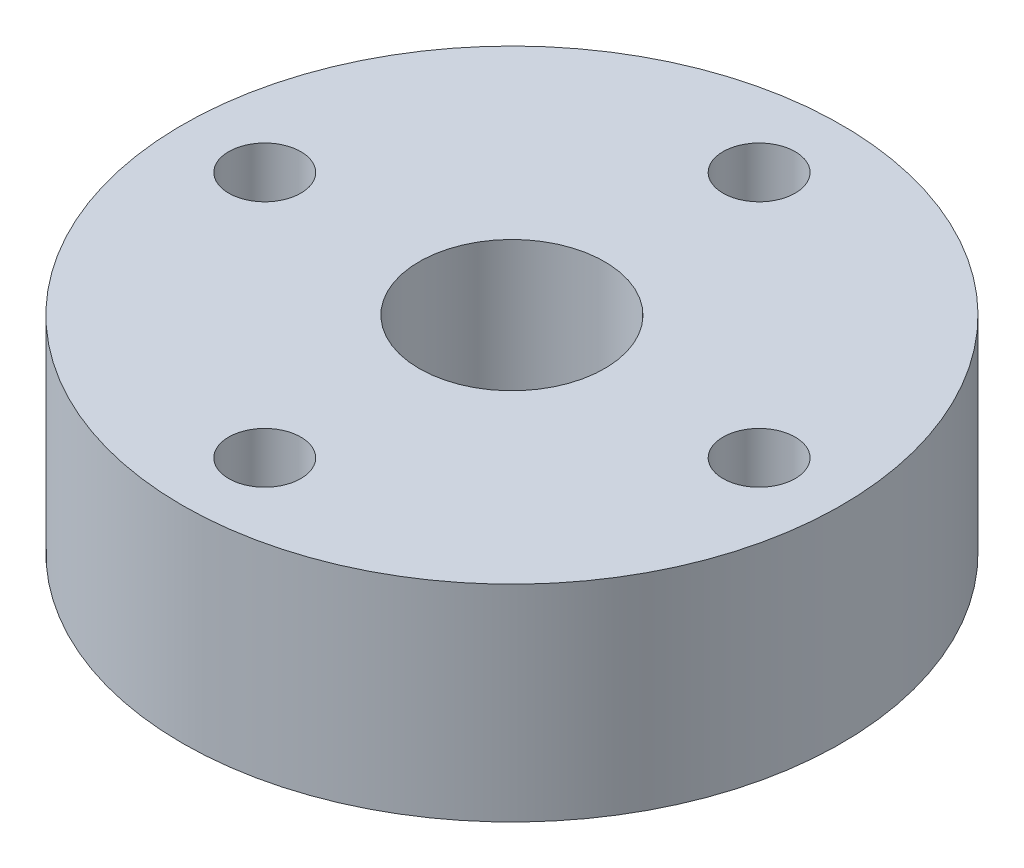
ISO-10303-21;
HEADER;
FILE_DESCRIPTION(('STEP AP214'),'2;1');
FILE_NAME('part.step','',(''),(''),'','','');
FILE_SCHEMA(('AUTOMOTIVE_DESIGN { 1 0 10303 214 1 1 1 1 }'));
ENDSEC;
DATA;
#1=APPLICATION_CONTEXT('core data for automotive mechanical design processes');
#2=APPLICATION_PROTOCOL_DEFINITION('international standard','automotive_design',2000,#1);
#3=PRODUCT_CONTEXT('',#1,'mechanical');
#4=PRODUCT('Part','Part','',(#3));
#5=PRODUCT_RELATED_PRODUCT_CATEGORY('part','',(#4));
#6=PRODUCT_DEFINITION_FORMATION('','',#4);
#7=PRODUCT_DEFINITION_CONTEXT('part definition',#1,'design');
#8=PRODUCT_DEFINITION('design','',#6,#7);
#9=PRODUCT_DEFINITION_SHAPE('','',#8);
#10=(LENGTH_UNIT() NAMED_UNIT(*) SI_UNIT(.MILLI.,.METRE.));
#11=(NAMED_UNIT(*) PLANE_ANGLE_UNIT() SI_UNIT($,.RADIAN.));
#12=(NAMED_UNIT(*) SI_UNIT($,.STERADIAN.) SOLID_ANGLE_UNIT());
#13=UNCERTAINTY_MEASURE_WITH_UNIT(LENGTH_MEASURE(1.E-05),#10,'distance_accuracy_value','');
#14=(GEOMETRIC_REPRESENTATION_CONTEXT(3) GLOBAL_UNCERTAINTY_ASSIGNED_CONTEXT((#13)) GLOBAL_UNIT_ASSIGNED_CONTEXT((#10,
#11,#12)) REPRESENTATION_CONTEXT('',''));
#15=CARTESIAN_POINT('',(0.,0.,0.));
#16=DIRECTION('',(0.,0.,1.));
#17=DIRECTION('',(1.,0.,0.));
#18=AXIS2_PLACEMENT_3D('',#15,#16,#17);
#19=CARTESIAN_POINT('',(0.,10.,0.));
#20=DIRECTION('',(0.,-1.,0.));
#21=DIRECTION('',(0.,0.,-1.));
#22=AXIS2_PLACEMENT_3D('',#19,#20,#21);
#23=CYLINDRICAL_SURFACE('',#22,16.);
#24=CARTESIAN_POINT('',(0.,10.,0.));
#25=DIRECTION('',(0.,1.,0.));
#26=DIRECTION('',(0.,0.,1.));
#27=AXIS2_PLACEMENT_3D('',#24,#25,#26);
#28=CIRCLE('',#27,16.);
#29=CARTESIAN_POINT('',(0.,10.,16.));
#30=VERTEX_POINT('',#29);
#31=EDGE_CURVE('E45',#30,#30,#28,.T.);
#32=ORIENTED_EDGE('',*,*,#31,.F.);
#33=EDGE_LOOP('',(#32));
#34=FACE_BOUND('',#33,.T.);
#35=CARTESIAN_POINT('',(0.,0.,0.));
#36=DIRECTION('',(0.,1.,0.));
#37=DIRECTION('',(0.,0.,1.));
#38=AXIS2_PLACEMENT_3D('',#35,#36,#37);
#39=CIRCLE('',#38,16.);
#40=CARTESIAN_POINT('',(0.,0.,16.));
#41=VERTEX_POINT('',#40);
#42=EDGE_CURVE('E65',#41,#41,#39,.T.);
#43=ORIENTED_EDGE('',*,*,#42,.T.);
#44=EDGE_LOOP('',(#43));
#45=FACE_BOUND('',#44,.T.);
#46=ADVANCED_FACE('F37',(#34,#45),#23,.T.);
#47=CARTESIAN_POINT('',(0.,10.,-12.));
#48=DIRECTION('',(0.,-1.,0.));
#49=DIRECTION('',(0.,0.,-1.));
#50=AXIS2_PLACEMENT_3D('',#47,#48,#49);
#51=CYLINDRICAL_SURFACE('',#50,1.75);
#52=CARTESIAN_POINT('',(0.,10.,-12.));
#53=DIRECTION('',(0.,1.,0.));
#54=DIRECTION('',(0.,0.,1.));
#55=AXIS2_PLACEMENT_3D('',#52,#53,#54);
#56=CIRCLE('',#55,1.75);
#57=CARTESIAN_POINT('',(0.,10.,-10.25));
#58=VERTEX_POINT('',#57);
#59=EDGE_CURVE('E50',#58,#58,#56,.T.);
#60=ORIENTED_EDGE('',*,*,#59,.T.);
#61=EDGE_LOOP('',(#60));
#62=FACE_BOUND('',#61,.T.);
#63=CARTESIAN_POINT('',(0.,0.,-12.));
#64=DIRECTION('',(0.,1.,0.));
#65=DIRECTION('',(0.,0.,1.));
#66=AXIS2_PLACEMENT_3D('',#63,#64,#65);
#67=CIRCLE('',#66,1.75);
#68=CARTESIAN_POINT('',(0.,0.,-10.25));
#69=VERTEX_POINT('',#68);
#70=EDGE_CURVE('E63',#69,#69,#67,.T.);
#71=ORIENTED_EDGE('',*,*,#70,.F.);
#72=EDGE_LOOP('',(#71));
#73=FACE_BOUND('',#72,.T.);
#74=ADVANCED_FACE('F86',(#62,#73),#51,.F.);
#75=CARTESIAN_POINT('',(-12.,10.,0.));
#76=DIRECTION('',(0.,-1.,0.));
#77=DIRECTION('',(0.,0.,-1.));
#78=AXIS2_PLACEMENT_3D('',#75,#76,#77);
#79=CYLINDRICAL_SURFACE('',#78,1.75);
#80=CARTESIAN_POINT('',(-12.,10.,0.));
#81=DIRECTION('',(0.,1.,0.));
#82=DIRECTION('',(0.,0.,1.));
#83=AXIS2_PLACEMENT_3D('',#80,#81,#82);
#84=CIRCLE('',#83,1.75);
#85=CARTESIAN_POINT('',(-12.,10.,1.75));
#86=VERTEX_POINT('',#85);
#87=EDGE_CURVE('E79',#86,#86,#84,.T.);
#88=ORIENTED_EDGE('',*,*,#87,.T.);
#89=EDGE_LOOP('',(#88));
#90=FACE_BOUND('',#89,.T.);
#91=CARTESIAN_POINT('',(-12.,0.,0.));
#92=DIRECTION('',(0.,1.,0.));
#93=DIRECTION('',(0.,0.,1.));
#94=AXIS2_PLACEMENT_3D('',#91,#92,#93);
#95=CIRCLE('',#94,1.75);
#96=CARTESIAN_POINT('',(-12.,0.,1.75));
#97=VERTEX_POINT('',#96);
#98=EDGE_CURVE('E60',#97,#97,#95,.T.);
#99=ORIENTED_EDGE('',*,*,#98,.F.);
#100=EDGE_LOOP('',(#99));
#101=FACE_BOUND('',#100,.T.);
#102=ADVANCED_FACE('F104',(#90,#101),#79,.F.);
#103=CARTESIAN_POINT('',(0.,10.,12.));
#104=DIRECTION('',(0.,-1.,0.));
#105=DIRECTION('',(0.,0.,-1.));
#106=AXIS2_PLACEMENT_3D('',#103,#104,#105);
#107=CYLINDRICAL_SURFACE('',#106,1.75);
#108=CARTESIAN_POINT('',(0.,10.,12.));
#109=DIRECTION('',(0.,1.,0.));
#110=DIRECTION('',(0.,0.,1.));
#111=AXIS2_PLACEMENT_3D('',#108,#109,#110);
#112=CIRCLE('',#111,1.75);
#113=CARTESIAN_POINT('',(0.,10.,13.75));
#114=VERTEX_POINT('',#113);
#115=EDGE_CURVE('E74',#114,#114,#112,.T.);
#116=ORIENTED_EDGE('',*,*,#115,.T.);
#117=EDGE_LOOP('',(#116));
#118=FACE_BOUND('',#117,.T.);
#119=CARTESIAN_POINT('',(0.,0.,12.));
#120=DIRECTION('',(0.,1.,0.));
#121=DIRECTION('',(0.,0.,1.));
#122=AXIS2_PLACEMENT_3D('',#119,#120,#121);
#123=CIRCLE('',#122,1.75);
#124=CARTESIAN_POINT('',(0.,0.,13.75));
#125=VERTEX_POINT('',#124);
#126=EDGE_CURVE('E57',#125,#125,#123,.T.);
#127=ORIENTED_EDGE('',*,*,#126,.F.);
#128=EDGE_LOOP('',(#127));
#129=FACE_BOUND('',#128,.T.);
#130=ADVANCED_FACE('F110',(#118,#129),#107,.F.);
#131=CARTESIAN_POINT('',(12.,10.,0.));
#132=DIRECTION('',(0.,-1.,0.));
#133=DIRECTION('',(0.,0.,-1.));
#134=AXIS2_PLACEMENT_3D('',#131,#132,#133);
#135=CYLINDRICAL_SURFACE('',#134,1.75);
#136=CARTESIAN_POINT('',(12.,10.,0.));
#137=DIRECTION('',(0.,1.,0.));
#138=DIRECTION('',(0.,0.,1.));
#139=AXIS2_PLACEMENT_3D('',#136,#137,#138);
#140=CIRCLE('',#139,1.75);
#141=CARTESIAN_POINT('',(12.,10.,1.75));
#142=VERTEX_POINT('',#141);
#143=EDGE_CURVE('E70',#142,#142,#140,.T.);
#144=ORIENTED_EDGE('',*,*,#143,.T.);
#145=EDGE_LOOP('',(#144));
#146=FACE_BOUND('',#145,.T.);
#147=CARTESIAN_POINT('',(12.,0.,0.));
#148=DIRECTION('',(0.,1.,0.));
#149=DIRECTION('',(0.,0.,1.));
#150=AXIS2_PLACEMENT_3D('',#147,#148,#149);
#151=CIRCLE('',#150,1.75);
#152=CARTESIAN_POINT('',(12.,0.,1.75));
#153=VERTEX_POINT('',#152);
#154=EDGE_CURVE('E54',#153,#153,#151,.T.);
#155=ORIENTED_EDGE('',*,*,#154,.F.);
#156=EDGE_LOOP('',(#155));
#157=FACE_BOUND('',#156,.T.);
#158=ADVANCED_FACE('F39',(#146,#157),#135,.F.);
#159=CARTESIAN_POINT('',(0.,10.,0.));
#160=DIRECTION('',(0.,-1.,0.));
#161=DIRECTION('',(0.,0.,-1.));
#162=AXIS2_PLACEMENT_3D('',#159,#160,#161);
#163=CYLINDRICAL_SURFACE('',#162,4.5);
#164=CARTESIAN_POINT('',(0.,10.,0.));
#165=DIRECTION('',(0.,1.,0.));
#166=DIRECTION('',(0.,0.,1.));
#167=AXIS2_PLACEMENT_3D('',#164,#165,#166);
#168=CIRCLE('',#167,4.5);
#169=CARTESIAN_POINT('',(0.,10.,4.5));
#170=VERTEX_POINT('',#169);
#171=EDGE_CURVE('E10',#170,#170,#168,.T.);
#172=ORIENTED_EDGE('',*,*,#171,.T.);
#173=EDGE_LOOP('',(#172));
#174=FACE_BOUND('',#173,.T.);
#175=CARTESIAN_POINT('',(0.,0.,0.));
#176=DIRECTION('',(0.,1.,0.));
#177=DIRECTION('',(0.,0.,1.));
#178=AXIS2_PLACEMENT_3D('',#175,#176,#177);
#179=CIRCLE('',#178,4.5);
#180=CARTESIAN_POINT('',(0.,0.,4.5));
#181=VERTEX_POINT('',#180);
#182=EDGE_CURVE('E41',#181,#181,#179,.T.);
#183=ORIENTED_EDGE('',*,*,#182,.F.);
#184=EDGE_LOOP('',(#183));
#185=FACE_BOUND('',#184,.T.);
#186=ADVANCED_FACE('F93',(#174,#185),#163,.F.);
#187=CARTESIAN_POINT('',(0.,10.,0.));
#188=DIRECTION('',(0.,1.,0.));
#189=DIRECTION('',(0.,0.,1.));
#190=AXIS2_PLACEMENT_3D('',#187,#188,#189);
#191=PLANE('',#190);
#192=ORIENTED_EDGE('',*,*,#143,.F.);
#193=EDGE_LOOP('',(#192));
#194=FACE_BOUND('',#193,.T.);
#195=ORIENTED_EDGE('',*,*,#115,.F.);
#196=EDGE_LOOP('',(#195));
#197=FACE_BOUND('',#196,.T.);
#198=ORIENTED_EDGE('',*,*,#87,.F.);
#199=EDGE_LOOP('',(#198));
#200=FACE_BOUND('',#199,.T.);
#201=ORIENTED_EDGE('',*,*,#59,.F.);
#202=EDGE_LOOP('',(#201));
#203=FACE_BOUND('',#202,.T.);
#204=ORIENTED_EDGE('',*,*,#31,.T.);
#205=EDGE_LOOP('',(#204));
#206=FACE_BOUND('',#205,.T.);
#207=ORIENTED_EDGE('',*,*,#171,.F.);
#208=EDGE_LOOP('',(#207));
#209=FACE_BOUND('',#208,.T.);
#210=ADVANCED_FACE('F89',(#194,#197,#200,#203,#206,#209),#191,.T.);
#211=CARTESIAN_POINT('',(0.,0.,0.));
#212=DIRECTION('',(0.,1.,0.));
#213=DIRECTION('',(0.,0.,1.));
#214=AXIS2_PLACEMENT_3D('',#211,#212,#213);
#215=PLANE('',#214);
#216=ORIENTED_EDGE('',*,*,#154,.T.);
#217=EDGE_LOOP('',(#216));
#218=FACE_BOUND('',#217,.T.);
#219=ORIENTED_EDGE('',*,*,#126,.T.);
#220=EDGE_LOOP('',(#219));
#221=FACE_BOUND('',#220,.T.);
#222=ORIENTED_EDGE('',*,*,#98,.T.);
#223=EDGE_LOOP('',(#222));
#224=FACE_BOUND('',#223,.T.);
#225=ORIENTED_EDGE('',*,*,#70,.T.);
#226=EDGE_LOOP('',(#225));
#227=FACE_BOUND('',#226,.T.);
#228=ORIENTED_EDGE('',*,*,#42,.F.);
#229=EDGE_LOOP('',(#228));
#230=FACE_BOUND('',#229,.T.);
#231=ORIENTED_EDGE('',*,*,#182,.T.);
#232=EDGE_LOOP('',(#231));
#233=FACE_BOUND('',#232,.T.);
#234=ADVANCED_FACE('F92',(#218,#221,#224,#227,#230,#233),#215,.F.);
#235=CLOSED_SHELL('',(#46,#74,#102,#130,#158,#186,#210,#234));
#236=MANIFOLD_SOLID_BREP('B2',#235);
#237=ADVANCED_BREP_SHAPE_REPRESENTATION('',(#18,#236),#14);
#238=SHAPE_DEFINITION_REPRESENTATION(#9,#237);
ENDSEC;
END-ISO-10303-21;
